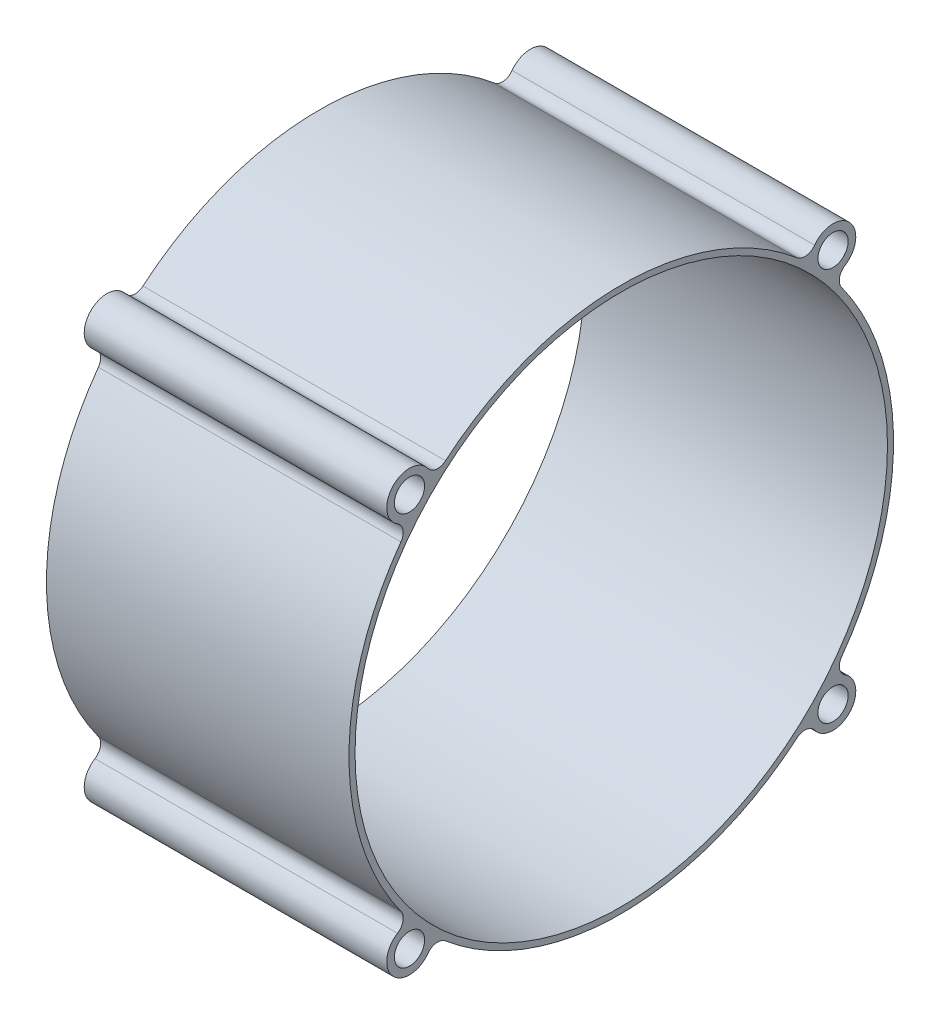
ISO-10303-21;
HEADER;
FILE_DESCRIPTION(('STEP AP214'),'2;1');
FILE_NAME('part.step','',(''),(''),'','','');
FILE_SCHEMA(('AUTOMOTIVE_DESIGN { 1 0 10303 214 1 1 1 1 }'));
ENDSEC;
DATA;
#1=APPLICATION_CONTEXT('core data for automotive mechanical design processes');
#2=APPLICATION_PROTOCOL_DEFINITION('international standard','automotive_design',2000,#1);
#3=PRODUCT_CONTEXT('',#1,'mechanical');
#4=PRODUCT('Part','Part','',(#3));
#5=PRODUCT_RELATED_PRODUCT_CATEGORY('part','',(#4));
#6=PRODUCT_DEFINITION_FORMATION('','',#4);
#7=PRODUCT_DEFINITION_CONTEXT('part definition',#1,'design');
#8=PRODUCT_DEFINITION('design','',#6,#7);
#9=PRODUCT_DEFINITION_SHAPE('','',#8);
#10=(LENGTH_UNIT() NAMED_UNIT(*) SI_UNIT(.MILLI.,.METRE.));
#11=(NAMED_UNIT(*) PLANE_ANGLE_UNIT() SI_UNIT($,.RADIAN.));
#12=(NAMED_UNIT(*) SI_UNIT($,.STERADIAN.) SOLID_ANGLE_UNIT());
#13=UNCERTAINTY_MEASURE_WITH_UNIT(LENGTH_MEASURE(1.E-05),#10,'distance_accuracy_value','');
#14=(GEOMETRIC_REPRESENTATION_CONTEXT(3) GLOBAL_UNCERTAINTY_ASSIGNED_CONTEXT((#13)) GLOBAL_UNIT_ASSIGNED_CONTEXT((#10,
#11,#12)) REPRESENTATION_CONTEXT('',''));
#15=CARTESIAN_POINT('',(0.,0.,0.));
#16=DIRECTION('',(0.,0.,1.));
#17=DIRECTION('',(1.,0.,0.));
#18=AXIS2_PLACEMENT_3D('',#15,#16,#17);
#19=CARTESIAN_POINT('',(50.,0.,0.));
#20=DIRECTION('',(-1.,0.,0.));
#21=DIRECTION('',(0.,0.,1.));
#22=AXIS2_PLACEMENT_3D('',#19,#20,#21);
#23=CYLINDRICAL_SURFACE('',#22,44.);
#24=CARTESIAN_POINT('',(0.,0.,0.));
#25=DIRECTION('',(1.,0.,0.));
#26=DIRECTION('',(0.,0.,-1.));
#27=AXIS2_PLACEMENT_3D('',#24,#25,#26);
#28=CIRCLE('',#27,44.);
#29=CARTESIAN_POINT('',(0.,0.,-44.));
#30=VERTEX_POINT('',#29);
#31=EDGE_CURVE('E509',#30,#30,#28,.T.);
#32=ORIENTED_EDGE('',*,*,#31,.F.);
#33=EDGE_LOOP('',(#32));
#34=FACE_BOUND('',#33,.T.);
#35=CARTESIAN_POINT('',(50.,0.,0.));
#36=DIRECTION('',(1.,0.,0.));
#37=DIRECTION('',(0.,0.,-1.));
#38=AXIS2_PLACEMENT_3D('',#35,#36,#37);
#39=CIRCLE('',#38,44.);
#40=CARTESIAN_POINT('',(50.,0.,-44.));
#41=VERTEX_POINT('',#40);
#42=EDGE_CURVE('E501',#41,#41,#39,.T.);
#43=ORIENTED_EDGE('',*,*,#42,.T.);
#44=EDGE_LOOP('',(#43));
#45=FACE_BOUND('',#44,.T.);
#46=ADVANCED_FACE('F258',(#34,#45),#23,.F.);
#47=CARTESIAN_POINT('',(0.,0.,0.));
#48=DIRECTION('',(1.,0.,0.));
#49=DIRECTION('',(0.,0.,-1.));
#50=AXIS2_PLACEMENT_3D('',#47,#48,#49);
#51=PLANE('',#50);
#52=CARTESIAN_POINT('',(0.,-32.4999999999999,-35.));
#53=DIRECTION('',(1.,0.,0.));
#54=DIRECTION('',(0.,0.,-1.));
#55=AXIS2_PLACEMENT_3D('',#52,#53,#54);
#56=CIRCLE('',#55,2.5);
#57=CARTESIAN_POINT('',(0.,-32.4999999999999,-37.5));
#58=VERTEX_POINT('',#57);
#59=EDGE_CURVE('E408',#58,#58,#56,.T.);
#60=ORIENTED_EDGE('',*,*,#59,.T.);
#61=EDGE_LOOP('',(#60));
#62=FACE_BOUND('',#61,.T.);
#63=CARTESIAN_POINT('',(0.,0.,0.));
#64=DIRECTION('',(1.,0.,0.));
#65=DIRECTION('',(0.,0.,-1.));
#66=AXIS2_PLACEMENT_3D('',#63,#64,#65);
#67=CIRCLE('',#66,45.);
#68=CARTESIAN_POINT('',(0.,-26.4296981736849,-36.4207503279095));
#69=VERTEX_POINT('',#68);
#70=CARTESIAN_POINT('',(0.,26.4296981736849,-36.4207503279095));
#71=VERTEX_POINT('',#70);
#72=EDGE_CURVE('E389',#69,#71,#67,.T.);
#73=ORIENTED_EDGE('',*,*,#72,.F.);
#74=CARTESIAN_POINT('',(0.,-27.6043514258486,-38.0394503424832));
#75=DIRECTION('',(1.,0.,0.));
#76=DIRECTION('',(0.,0.,-1.));
#77=AXIS2_PLACEMENT_3D('',#74,#75,#76);
#78=CIRCLE('',#77,2.);
#79=CARTESIAN_POINT('',(0.,-29.3035117035373,-36.9845312220172));
#80=VERTEX_POINT('',#79);
#81=EDGE_CURVE('E372',#69,#80,#78,.T.);
#82=ORIENTED_EDGE('',*,*,#81,.T.);
#83=CARTESIAN_POINT('',(0.,-32.4999999999999,-35.));
#84=DIRECTION('',(1.,0.,0.));
#85=DIRECTION('',(0.,0.,-1.));
#86=AXIS2_PLACEMENT_3D('',#83,#84,#85);
#87=CIRCLE('',#86,3.76243293635696);
#88=CARTESIAN_POINT('',(0.,-34.7155467090924,-31.9590701454303));
#89=VERTEX_POINT('',#88);
#90=EDGE_CURVE('E571',#89,#80,#87,.T.);
#91=ORIENTED_EDGE('',*,*,#90,.F.);
#92=CARTESIAN_POINT('',(0.,-35.8932669483999,-30.3426002143999));
#93=DIRECTION('',(1.,0.,0.));
#94=DIRECTION('',(0.,0.,-1.));
#95=AXIS2_PLACEMENT_3D('',#92,#93,#94);
#96=CIRCLE('',#95,2.);
#97=CARTESIAN_POINT('',(0.,-34.3658938867659,-29.0514257371914));
#98=VERTEX_POINT('',#97);
#99=EDGE_CURVE('E462',#89,#98,#96,.T.);
#100=ORIENTED_EDGE('',*,*,#99,.T.);
#101=CARTESIAN_POINT('',(0.,-34.3658938867659,29.0514257371913));
#102=VERTEX_POINT('',#101);
#103=EDGE_CURVE('E401',#102,#98,#67,.T.);
#104=ORIENTED_EDGE('',*,*,#103,.F.);
#105=CARTESIAN_POINT('',(0.,-35.8932669484,30.3426002143998));
#106=DIRECTION('',(1.,0.,0.));
#107=DIRECTION('',(0.,0.,-1.));
#108=AXIS2_PLACEMENT_3D('',#105,#106,#107);
#109=CIRCLE('',#108,2.);
#110=CARTESIAN_POINT('',(0.,-34.7155467090925,31.9590701454302));
#111=VERTEX_POINT('',#110);
#112=EDGE_CURVE('E468',#102,#111,#109,.T.);
#113=ORIENTED_EDGE('',*,*,#112,.T.);
#114=CARTESIAN_POINT('',(0.,-32.5,35.));
#115=DIRECTION('',(1.,0.,0.));
#116=DIRECTION('',(0.,0.,-1.));
#117=AXIS2_PLACEMENT_3D('',#114,#115,#116);
#118=CIRCLE('',#117,3.762432936357);
#119=CARTESIAN_POINT('',(0.,-29.3035117035373,36.9845312220172));
#120=VERTEX_POINT('',#119);
#121=EDGE_CURVE('E529',#120,#111,#118,.T.);
#122=ORIENTED_EDGE('',*,*,#121,.F.);
#123=CARTESIAN_POINT('',(0.,-27.6043514258486,38.0394503424832));
#124=DIRECTION('',(1.,0.,0.));
#125=DIRECTION('',(0.,0.,-1.));
#126=AXIS2_PLACEMENT_3D('',#123,#124,#125);
#127=CIRCLE('',#126,2.);
#128=CARTESIAN_POINT('',(0.,-26.4296981736849,36.4207503279095));
#129=VERTEX_POINT('',#128);
#130=EDGE_CURVE('E474',#120,#129,#127,.T.);
#131=ORIENTED_EDGE('',*,*,#130,.T.);
#132=CARTESIAN_POINT('',(0.,0.,0.));
#133=DIRECTION('',(1.,0.,0.));
#134=DIRECTION('',(0.,0.,-1.));
#135=AXIS2_PLACEMENT_3D('',#132,#133,#134);
#136=CIRCLE('',#135,45.);
#137=CARTESIAN_POINT('',(0.,26.4296981736849,36.4207503279095));
#138=VERTEX_POINT('',#137);
#139=EDGE_CURVE('E505',#138,#129,#136,.T.);
#140=ORIENTED_EDGE('',*,*,#139,.F.);
#141=CARTESIAN_POINT('',(0.,27.6043514258486,38.0394503424832));
#142=DIRECTION('',(1.,0.,0.));
#143=DIRECTION('',(0.,0.,-1.));
#144=AXIS2_PLACEMENT_3D('',#141,#142,#143);
#145=CIRCLE('',#144,2.);
#146=CARTESIAN_POINT('',(0.,29.3035117035373,36.9845312220172));
#147=VERTEX_POINT('',#146);
#148=EDGE_CURVE('E480',#138,#147,#145,.T.);
#149=ORIENTED_EDGE('',*,*,#148,.T.);
#150=CARTESIAN_POINT('',(0.,32.5,35.));
#151=DIRECTION('',(1.,0.,0.));
#152=DIRECTION('',(0.,0.,-1.));
#153=AXIS2_PLACEMENT_3D('',#150,#151,#152);
#154=CIRCLE('',#153,3.762432936357);
#155=CARTESIAN_POINT('',(0.,34.7155467090925,31.9590701454302));
#156=VERTEX_POINT('',#155);
#157=EDGE_CURVE('E545',#156,#147,#154,.T.);
#158=ORIENTED_EDGE('',*,*,#157,.F.);
#159=CARTESIAN_POINT('',(0.,35.8932669484,30.3426002143998));
#160=DIRECTION('',(1.,0.,0.));
#161=DIRECTION('',(0.,0.,-1.));
#162=AXIS2_PLACEMENT_3D('',#159,#160,#161);
#163=CIRCLE('',#162,2.);
#164=CARTESIAN_POINT('',(0.,34.3658938867659,29.0514257371913));
#165=VERTEX_POINT('',#164);
#166=EDGE_CURVE('E486',#156,#165,#163,.T.);
#167=ORIENTED_EDGE('',*,*,#166,.T.);
#168=CARTESIAN_POINT('',(0.,0.,0.));
#169=DIRECTION('',(1.,0.,0.));
#170=DIRECTION('',(0.,0.,-1.));
#171=AXIS2_PLACEMENT_3D('',#168,#169,#170);
#172=CIRCLE('',#171,45.);
#173=CARTESIAN_POINT('',(0.,34.3658938867659,-29.0514257371914));
#174=VERTEX_POINT('',#173);
#175=EDGE_CURVE('E517',#174,#165,#172,.T.);
#176=ORIENTED_EDGE('',*,*,#175,.F.);
#177=CARTESIAN_POINT('',(0.,35.8932669483999,-30.3426002143999));
#178=DIRECTION('',(1.,0.,0.));
#179=DIRECTION('',(0.,0.,-1.));
#180=AXIS2_PLACEMENT_3D('',#177,#178,#179);
#181=CIRCLE('',#180,2.);
#182=CARTESIAN_POINT('',(0.,34.7155467090924,-31.9590701454303));
#183=VERTEX_POINT('',#182);
#184=EDGE_CURVE('E492',#174,#183,#181,.T.);
#185=ORIENTED_EDGE('',*,*,#184,.T.);
#186=CARTESIAN_POINT('',(0.,32.4999999999999,-35.));
#187=DIRECTION('',(1.,0.,0.));
#188=DIRECTION('',(0.,0.,-1.));
#189=AXIS2_PLACEMENT_3D('',#186,#187,#188);
#190=CIRCLE('',#189,3.76243293635696);
#191=CARTESIAN_POINT('',(0.,29.3035117035373,-36.9845312220172));
#192=VERTEX_POINT('',#191);
#193=EDGE_CURVE('E560',#192,#183,#190,.T.);
#194=ORIENTED_EDGE('',*,*,#193,.F.);
#195=CARTESIAN_POINT('',(0.,27.6043514258486,-38.0394503424833));
#196=DIRECTION('',(1.,0.,0.));
#197=DIRECTION('',(0.,0.,-1.));
#198=AXIS2_PLACEMENT_3D('',#195,#196,#197);
#199=CIRCLE('',#198,2.);
#200=EDGE_CURVE('E267',#192,#71,#199,.T.);
#201=ORIENTED_EDGE('',*,*,#200,.T.);
#202=EDGE_LOOP('',(#73,#82,#91,#100,#104,#113,#122,#131,#140,#149,#158,#167,#176,#185,#194,#201));
#203=FACE_BOUND('',#202,.T.);
#204=ORIENTED_EDGE('',*,*,#31,.T.);
#205=EDGE_LOOP('',(#204));
#206=FACE_BOUND('',#205,.T.);
#207=CARTESIAN_POINT('',(0.,-32.5,35.));
#208=DIRECTION('',(1.,0.,0.));
#209=DIRECTION('',(0.,0.,-1.));
#210=AXIS2_PLACEMENT_3D('',#207,#208,#209);
#211=CIRCLE('',#210,2.5);
#212=CARTESIAN_POINT('',(0.,-32.5,32.5));
#213=VERTEX_POINT('',#212);
#214=EDGE_CURVE('E533',#213,#213,#211,.T.);
#215=ORIENTED_EDGE('',*,*,#214,.T.);
#216=EDGE_LOOP('',(#215));
#217=FACE_BOUND('',#216,.T.);
#218=CARTESIAN_POINT('',(0.,32.5,35.));
#219=DIRECTION('',(1.,0.,0.));
#220=DIRECTION('',(0.,0.,-1.));
#221=AXIS2_PLACEMENT_3D('',#218,#219,#220);
#222=CIRCLE('',#221,2.5);
#223=CARTESIAN_POINT('',(0.,32.5,32.5));
#224=VERTEX_POINT('',#223);
#225=EDGE_CURVE('E549',#224,#224,#222,.F.);
#226=ORIENTED_EDGE('',*,*,#225,.F.);
#227=EDGE_LOOP('',(#226));
#228=FACE_BOUND('',#227,.T.);
#229=CARTESIAN_POINT('',(0.,32.4999999999999,-35.));
#230=DIRECTION('',(1.,0.,0.));
#231=DIRECTION('',(0.,0.,-1.));
#232=AXIS2_PLACEMENT_3D('',#229,#230,#231);
#233=CIRCLE('',#232,2.5);
#234=CARTESIAN_POINT('',(0.,32.4999999999999,-37.5));
#235=VERTEX_POINT('',#234);
#236=EDGE_CURVE('E563',#235,#235,#233,.T.);
#237=ORIENTED_EDGE('',*,*,#236,.T.);
#238=EDGE_LOOP('',(#237));
#239=FACE_BOUND('',#238,.T.);
#240=ADVANCED_FACE('F396',(#62,#203,#206,#217,#228,#239),#51,.F.);
#241=CARTESIAN_POINT('',(50.,0.,0.));
#242=DIRECTION('',(-1.,0.,0.));
#243=DIRECTION('',(0.,0.,1.));
#244=AXIS2_PLACEMENT_3D('',#241,#242,#243);
#245=CYLINDRICAL_SURFACE('',#244,45.);
#246=ORIENTED_EDGE('',*,*,#139,.T.);
#247=DIRECTION('',(-1.,0.,0.));
#248=VECTOR('',#247,1.);
#249=CARTESIAN_POINT('',(50.,-26.4296981736849,36.4207503279095));
#250=LINE('',#249,#248);
#251=CARTESIAN_POINT('',(50.,-26.4296981736849,36.4207503279095));
#252=VERTEX_POINT('',#251);
#253=EDGE_CURVE('E437',#129,#252,#250,.F.);
#254=ORIENTED_EDGE('',*,*,#253,.T.);
#255=CARTESIAN_POINT('',(50.,0.,0.));
#256=DIRECTION('',(1.,0.,0.));
#257=DIRECTION('',(0.,0.,-1.));
#258=AXIS2_PLACEMENT_3D('',#255,#256,#257);
#259=CIRCLE('',#258,45.);
#260=CARTESIAN_POINT('',(50.,26.4296981736849,36.4207503279095));
#261=VERTEX_POINT('',#260);
#262=EDGE_CURVE('E412',#261,#252,#259,.T.);
#263=ORIENTED_EDGE('',*,*,#262,.F.);
#264=DIRECTION('',(-1.,0.,0.));
#265=VECTOR('',#264,1.);
#266=CARTESIAN_POINT('',(50.,26.4296981736849,36.4207503279095));
#267=LINE('',#266,#265);
#268=EDGE_CURVE('E433',#261,#138,#267,.T.);
#269=ORIENTED_EDGE('',*,*,#268,.T.);
#270=EDGE_LOOP('',(#246,#254,#263,#269));
#271=FACE_BOUND('',#270,.T.);
#272=ADVANCED_FACE('F604',(#271),#245,.T.);
#273=CARTESIAN_POINT('',(50.,0.,0.));
#274=DIRECTION('',(1.,0.,0.));
#275=DIRECTION('',(0.,0.,-1.));
#276=AXIS2_PLACEMENT_3D('',#273,#274,#275);
#277=PLANE('',#276);
#278=CARTESIAN_POINT('',(50.,-32.4999999999999,-35.));
#279=DIRECTION('',(1.,0.,0.));
#280=DIRECTION('',(0.,0.,-1.));
#281=AXIS2_PLACEMENT_3D('',#278,#279,#280);
#282=CIRCLE('',#281,2.5);
#283=CARTESIAN_POINT('',(50.,-32.4999999999999,-37.5));
#284=VERTEX_POINT('',#283);
#285=EDGE_CURVE('E682',#284,#284,#282,.T.);
#286=ORIENTED_EDGE('',*,*,#285,.F.);
#287=EDGE_LOOP('',(#286));
#288=FACE_BOUND('',#287,.T.);
#289=CARTESIAN_POINT('',(50.,0.,0.));
#290=DIRECTION('',(1.,0.,0.));
#291=DIRECTION('',(0.,0.,-1.));
#292=AXIS2_PLACEMENT_3D('',#289,#290,#291);
#293=CIRCLE('',#292,45.);
#294=CARTESIAN_POINT('',(50.,-34.3658938867659,29.0514257371913));
#295=VERTEX_POINT('',#294);
#296=CARTESIAN_POINT('',(50.,-34.3658938867659,-29.0514257371914));
#297=VERTEX_POINT('',#296);
#298=EDGE_CURVE('E400',#295,#297,#293,.T.);
#299=ORIENTED_EDGE('',*,*,#298,.T.);
#300=CARTESIAN_POINT('',(50.,-35.8932669483999,-30.3426002143999));
#301=DIRECTION('',(1.,0.,0.));
#302=DIRECTION('',(0.,0.,-1.));
#303=AXIS2_PLACEMENT_3D('',#300,#301,#302);
#304=CIRCLE('',#303,2.);
#305=CARTESIAN_POINT('',(50.,-34.7155467090924,-31.9590701454303));
#306=VERTEX_POINT('',#305);
#307=EDGE_CURVE('E465',#297,#306,#304,.F.);
#308=ORIENTED_EDGE('',*,*,#307,.T.);
#309=CARTESIAN_POINT('',(50.,-32.4999999999999,-35.));
#310=DIRECTION('',(1.,0.,0.));
#311=DIRECTION('',(0.,0.,-1.));
#312=AXIS2_PLACEMENT_3D('',#309,#310,#311);
#313=CIRCLE('',#312,3.76243293635696);
#314=CARTESIAN_POINT('',(50.,-29.3035117035373,-36.9845312220172));
#315=VERTEX_POINT('',#314);
#316=EDGE_CURVE('E567',#306,#315,#313,.T.);
#317=ORIENTED_EDGE('',*,*,#316,.T.);
#318=CARTESIAN_POINT('',(50.,-27.6043514258486,-38.0394503424832));
#319=DIRECTION('',(1.,0.,0.));
#320=DIRECTION('',(0.,0.,-1.));
#321=AXIS2_PLACEMENT_3D('',#318,#319,#320);
#322=CIRCLE('',#321,2.);
#323=CARTESIAN_POINT('',(50.,-26.4296981736849,-36.4207503279095));
#324=VERTEX_POINT('',#323);
#325=EDGE_CURVE('E383',#315,#324,#322,.F.);
#326=ORIENTED_EDGE('',*,*,#325,.T.);
#327=CARTESIAN_POINT('',(50.,26.4296981736849,-36.4207503279095));
#328=VERTEX_POINT('',#327);
#329=EDGE_CURVE('E391',#324,#328,#293,.T.);
#330=ORIENTED_EDGE('',*,*,#329,.T.);
#331=CARTESIAN_POINT('',(50.,27.6043514258486,-38.0394503424833));
#332=DIRECTION('',(1.,0.,0.));
#333=DIRECTION('',(0.,0.,-1.));
#334=AXIS2_PLACEMENT_3D('',#331,#332,#333);
#335=CIRCLE('',#334,2.);
#336=CARTESIAN_POINT('',(50.,29.3035117035373,-36.9845312220172));
#337=VERTEX_POINT('',#336);
#338=EDGE_CURVE('E12',#328,#337,#335,.F.);
#339=ORIENTED_EDGE('',*,*,#338,.T.);
#340=CARTESIAN_POINT('',(50.,32.4999999999999,-35.));
#341=DIRECTION('',(1.,0.,0.));
#342=DIRECTION('',(0.,0.,-1.));
#343=AXIS2_PLACEMENT_3D('',#340,#341,#342);
#344=CIRCLE('',#343,3.76243293635696);
#345=CARTESIAN_POINT('',(50.,34.7155467090924,-31.9590701454303));
#346=VERTEX_POINT('',#345);
#347=EDGE_CURVE('E553',#337,#346,#344,.T.);
#348=ORIENTED_EDGE('',*,*,#347,.T.);
#349=CARTESIAN_POINT('',(50.,35.8932669483999,-30.3426002143999));
#350=DIRECTION('',(1.,0.,0.));
#351=DIRECTION('',(0.,0.,-1.));
#352=AXIS2_PLACEMENT_3D('',#349,#350,#351);
#353=CIRCLE('',#352,2.);
#354=CARTESIAN_POINT('',(50.,34.3658938867659,-29.0514257371914));
#355=VERTEX_POINT('',#354);
#356=EDGE_CURVE('E495',#346,#355,#353,.F.);
#357=ORIENTED_EDGE('',*,*,#356,.T.);
#358=CARTESIAN_POINT('',(50.,0.,0.));
#359=DIRECTION('',(1.,0.,0.));
#360=DIRECTION('',(0.,0.,-1.));
#361=AXIS2_PLACEMENT_3D('',#358,#359,#360);
#362=CIRCLE('',#361,45.);
#363=CARTESIAN_POINT('',(50.,34.3658938867659,29.0514257371913));
#364=VERTEX_POINT('',#363);
#365=EDGE_CURVE('E513',#355,#364,#362,.T.);
#366=ORIENTED_EDGE('',*,*,#365,.T.);
#367=CARTESIAN_POINT('',(50.,35.8932669484,30.3426002143998));
#368=DIRECTION('',(1.,0.,0.));
#369=DIRECTION('',(0.,0.,-1.));
#370=AXIS2_PLACEMENT_3D('',#367,#368,#369);
#371=CIRCLE('',#370,2.);
#372=CARTESIAN_POINT('',(50.,34.7155467090925,31.9590701454302));
#373=VERTEX_POINT('',#372);
#374=EDGE_CURVE('E489',#364,#373,#371,.F.);
#375=ORIENTED_EDGE('',*,*,#374,.T.);
#376=CARTESIAN_POINT('',(50.,32.5,35.));
#377=DIRECTION('',(1.,0.,0.));
#378=DIRECTION('',(0.,0.,-1.));
#379=AXIS2_PLACEMENT_3D('',#376,#377,#378);
#380=CIRCLE('',#379,3.762432936357);
#381=CARTESIAN_POINT('',(50.,29.3035117035373,36.9845312220172));
#382=VERTEX_POINT('',#381);
#383=EDGE_CURVE('E537',#373,#382,#380,.T.);
#384=ORIENTED_EDGE('',*,*,#383,.T.);
#385=CARTESIAN_POINT('',(50.,27.6043514258486,38.0394503424832));
#386=DIRECTION('',(1.,0.,0.));
#387=DIRECTION('',(0.,0.,-1.));
#388=AXIS2_PLACEMENT_3D('',#385,#386,#387);
#389=CIRCLE('',#388,2.);
#390=EDGE_CURVE('E483',#382,#261,#389,.F.);
#391=ORIENTED_EDGE('',*,*,#390,.T.);
#392=ORIENTED_EDGE('',*,*,#262,.T.);
#393=CARTESIAN_POINT('',(50.,-27.6043514258486,38.0394503424832));
#394=DIRECTION('',(1.,0.,0.));
#395=DIRECTION('',(0.,0.,-1.));
#396=AXIS2_PLACEMENT_3D('',#393,#394,#395);
#397=CIRCLE('',#396,2.);
#398=CARTESIAN_POINT('',(50.,-29.3035117035373,36.9845312220172));
#399=VERTEX_POINT('',#398);
#400=EDGE_CURVE('E477',#252,#399,#397,.F.);
#401=ORIENTED_EDGE('',*,*,#400,.T.);
#402=CARTESIAN_POINT('',(50.,-32.5,35.));
#403=DIRECTION('',(1.,0.,0.));
#404=DIRECTION('',(0.,0.,-1.));
#405=AXIS2_PLACEMENT_3D('',#402,#403,#404);
#406=CIRCLE('',#405,3.762432936357);
#407=CARTESIAN_POINT('',(50.,-34.7155467090925,31.9590701454302));
#408=VERTEX_POINT('',#407);
#409=EDGE_CURVE('E521',#399,#408,#406,.T.);
#410=ORIENTED_EDGE('',*,*,#409,.T.);
#411=CARTESIAN_POINT('',(50.,-35.8932669484,30.3426002143998));
#412=DIRECTION('',(1.,0.,0.));
#413=DIRECTION('',(0.,0.,-1.));
#414=AXIS2_PLACEMENT_3D('',#411,#412,#413);
#415=CIRCLE('',#414,2.);
#416=EDGE_CURVE('E471',#408,#295,#415,.F.);
#417=ORIENTED_EDGE('',*,*,#416,.T.);
#418=EDGE_LOOP('',(#299,#308,#317,#326,#330,#339,#348,#357,#366,#375,#384,#391,#392,#401,#410,#417));
#419=FACE_BOUND('',#418,.T.);
#420=ORIENTED_EDGE('',*,*,#42,.F.);
#421=EDGE_LOOP('',(#420));
#422=FACE_BOUND('',#421,.T.);
#423=CARTESIAN_POINT('',(50.,-32.5,35.));
#424=DIRECTION('',(1.,0.,0.));
#425=DIRECTION('',(0.,0.,-1.));
#426=AXIS2_PLACEMENT_3D('',#423,#424,#425);
#427=CIRCLE('',#426,2.5);
#428=CARTESIAN_POINT('',(50.,-32.5,32.5));
#429=VERTEX_POINT('',#428);
#430=EDGE_CURVE('E525',#429,#429,#427,.T.);
#431=ORIENTED_EDGE('',*,*,#430,.F.);
#432=EDGE_LOOP('',(#431));
#433=FACE_BOUND('',#432,.T.);
#434=CARTESIAN_POINT('',(50.,32.5,35.));
#435=DIRECTION('',(1.,0.,0.));
#436=DIRECTION('',(0.,0.,-1.));
#437=AXIS2_PLACEMENT_3D('',#434,#435,#436);
#438=CIRCLE('',#437,2.5);
#439=CARTESIAN_POINT('',(50.,32.5,32.5));
#440=VERTEX_POINT('',#439);
#441=EDGE_CURVE('E541',#440,#440,#438,.F.);
#442=ORIENTED_EDGE('',*,*,#441,.T.);
#443=EDGE_LOOP('',(#442));
#444=FACE_BOUND('',#443,.T.);
#445=CARTESIAN_POINT('',(50.,32.4999999999999,-35.));
#446=DIRECTION('',(1.,0.,0.));
#447=DIRECTION('',(0.,0.,-1.));
#448=AXIS2_PLACEMENT_3D('',#445,#446,#447);
#449=CIRCLE('',#448,2.5);
#450=CARTESIAN_POINT('',(50.,32.4999999999999,-37.5));
#451=VERTEX_POINT('',#450);
#452=EDGE_CURVE('E556',#451,#451,#449,.T.);
#453=ORIENTED_EDGE('',*,*,#452,.F.);
#454=EDGE_LOOP('',(#453));
#455=FACE_BOUND('',#454,.T.);
#456=ADVANCED_FACE('F574',(#288,#419,#422,#433,#444,#455),#277,.T.);
#457=CARTESIAN_POINT('',(50.,32.4999999999999,-35.));
#458=DIRECTION('',(-1.,0.,0.));
#459=DIRECTION('',(0.,0.,1.));
#460=AXIS2_PLACEMENT_3D('',#457,#458,#459);
#461=CYLINDRICAL_SURFACE('',#460,2.5);
#462=ORIENTED_EDGE('',*,*,#452,.T.);
#463=EDGE_LOOP('',(#462));
#464=FACE_BOUND('',#463,.T.);
#465=ORIENTED_EDGE('',*,*,#236,.F.);
#466=EDGE_LOOP('',(#465));
#467=FACE_BOUND('',#466,.T.);
#468=ADVANCED_FACE('F653',(#464,#467),#461,.F.);
#469=CARTESIAN_POINT('',(50.,32.4999999999999,-35.));
#470=DIRECTION('',(-1.,0.,0.));
#471=DIRECTION('',(0.,0.,1.));
#472=AXIS2_PLACEMENT_3D('',#469,#470,#471);
#473=CYLINDRICAL_SURFACE('',#472,3.76243293635696);
#474=ORIENTED_EDGE('',*,*,#193,.T.);
#475=DIRECTION('',(-1.,0.,0.));
#476=VECTOR('',#475,1.);
#477=CARTESIAN_POINT('',(50.,34.7155467090924,-31.9590701454303));
#478=LINE('',#477,#476);
#479=EDGE_CURVE('E274',#183,#346,#478,.F.);
#480=ORIENTED_EDGE('',*,*,#479,.T.);
#481=ORIENTED_EDGE('',*,*,#347,.F.);
#482=DIRECTION('',(-1.,0.,0.));
#483=VECTOR('',#482,1.);
#484=CARTESIAN_POINT('',(50.,29.3035117035373,-36.9845312220172));
#485=LINE('',#484,#483);
#486=EDGE_CURVE('E454',#337,#192,#485,.T.);
#487=ORIENTED_EDGE('',*,*,#486,.T.);
#488=EDGE_LOOP('',(#474,#480,#481,#487));
#489=FACE_BOUND('',#488,.T.);
#490=ADVANCED_FACE('F578',(#489),#473,.T.);
#491=CARTESIAN_POINT('',(50.,0.,0.));
#492=DIRECTION('',(-1.,0.,0.));
#493=DIRECTION('',(0.,0.,1.));
#494=AXIS2_PLACEMENT_3D('',#491,#492,#493);
#495=CYLINDRICAL_SURFACE('',#494,45.);
#496=ORIENTED_EDGE('',*,*,#329,.F.);
#497=DIRECTION('',(-1.,0.,0.));
#498=VECTOR('',#497,1.);
#499=CARTESIAN_POINT('',(50.,-26.4296981736849,-36.4207503279095));
#500=LINE('',#499,#498);
#501=EDGE_CURVE('E376',#324,#69,#500,.T.);
#502=ORIENTED_EDGE('',*,*,#501,.T.);
#503=ORIENTED_EDGE('',*,*,#72,.T.);
#504=DIRECTION('',(-1.,0.,0.));
#505=VECTOR('',#504,1.);
#506=CARTESIAN_POINT('',(50.,26.4296981736849,-36.4207503279095));
#507=LINE('',#506,#505);
#508=EDGE_CURVE('E394',#71,#328,#507,.F.);
#509=ORIENTED_EDGE('',*,*,#508,.T.);
#510=EDGE_LOOP('',(#496,#502,#503,#509));
#511=FACE_BOUND('',#510,.T.);
#512=ADVANCED_FACE('F388',(#511),#495,.T.);
#513=CARTESIAN_POINT('',(50.,-32.4999999999999,-35.));
#514=DIRECTION('',(-1.,0.,0.));
#515=DIRECTION('',(0.,0.,1.));
#516=AXIS2_PLACEMENT_3D('',#513,#514,#515);
#517=CYLINDRICAL_SURFACE('',#516,3.76243293635696);
#518=ORIENTED_EDGE('',*,*,#90,.T.);
#519=DIRECTION('',(-1.,0.,0.));
#520=VECTOR('',#519,1.);
#521=CARTESIAN_POINT('',(50.,-29.3035117035373,-36.9845312220172));
#522=LINE('',#521,#520);
#523=EDGE_CURVE('E377',#80,#315,#522,.F.);
#524=ORIENTED_EDGE('',*,*,#523,.T.);
#525=ORIENTED_EDGE('',*,*,#316,.F.);
#526=DIRECTION('',(-1.,0.,0.));
#527=VECTOR('',#526,1.);
#528=CARTESIAN_POINT('',(50.,-34.7155467090924,-31.9590701454303));
#529=LINE('',#528,#527);
#530=EDGE_CURVE('E393',#306,#89,#529,.T.);
#531=ORIENTED_EDGE('',*,*,#530,.T.);
#532=EDGE_LOOP('',(#518,#524,#525,#531));
#533=FACE_BOUND('',#532,.T.);
#534=ADVANCED_FACE('F630',(#533),#517,.T.);
#535=CARTESIAN_POINT('',(50.,-32.5,35.));
#536=DIRECTION('',(-1.,0.,0.));
#537=DIRECTION('',(0.,0.,1.));
#538=AXIS2_PLACEMENT_3D('',#535,#536,#537);
#539=CYLINDRICAL_SURFACE('',#538,2.5);
#540=ORIENTED_EDGE('',*,*,#430,.T.);
#541=EDGE_LOOP('',(#540));
#542=FACE_BOUND('',#541,.T.);
#543=ORIENTED_EDGE('',*,*,#214,.F.);
#544=EDGE_LOOP('',(#543));
#545=FACE_BOUND('',#544,.T.);
#546=ADVANCED_FACE('F632',(#542,#545),#539,.F.);
#547=CARTESIAN_POINT('',(50.,32.5,35.));
#548=DIRECTION('',(-1.,0.,0.));
#549=DIRECTION('',(0.,0.,1.));
#550=AXIS2_PLACEMENT_3D('',#547,#548,#549);
#551=CYLINDRICAL_SURFACE('',#550,2.5);
#552=ORIENTED_EDGE('',*,*,#441,.F.);
#553=EDGE_LOOP('',(#552));
#554=FACE_BOUND('',#553,.T.);
#555=ORIENTED_EDGE('',*,*,#225,.T.);
#556=EDGE_LOOP('',(#555));
#557=FACE_BOUND('',#556,.T.);
#558=ADVANCED_FACE('F638',(#554,#557),#551,.F.);
#559=ORIENTED_EDGE('',*,*,#175,.T.);
#560=DIRECTION('',(-1.,0.,0.));
#561=VECTOR('',#560,1.);
#562=CARTESIAN_POINT('',(50.,34.365893886766,29.0514257371913));
#563=LINE('',#562,#561);
#564=EDGE_CURVE('E451',#165,#364,#563,.F.);
#565=ORIENTED_EDGE('',*,*,#564,.T.);
#566=ORIENTED_EDGE('',*,*,#365,.F.);
#567=DIRECTION('',(-1.,0.,0.));
#568=VECTOR('',#567,1.);
#569=CARTESIAN_POINT('',(50.,34.3658938867659,-29.0514257371914));
#570=LINE('',#569,#568);
#571=EDGE_CURVE('E447',#355,#174,#570,.T.);
#572=ORIENTED_EDGE('',*,*,#571,.T.);
#573=EDGE_LOOP('',(#559,#565,#566,#572));
#574=FACE_BOUND('',#573,.T.);
#575=ADVANCED_FACE('F586',(#574),#495,.T.);
#576=CARTESIAN_POINT('',(50.,32.5,35.));
#577=DIRECTION('',(-1.,0.,0.));
#578=DIRECTION('',(0.,0.,1.));
#579=AXIS2_PLACEMENT_3D('',#576,#577,#578);
#580=CYLINDRICAL_SURFACE('',#579,3.762432936357);
#581=ORIENTED_EDGE('',*,*,#157,.T.);
#582=DIRECTION('',(-1.,0.,0.));
#583=VECTOR('',#582,1.);
#584=CARTESIAN_POINT('',(50.,29.3035117035373,36.9845312220172));
#585=LINE('',#584,#583);
#586=EDGE_CURVE('E444',#147,#382,#585,.F.);
#587=ORIENTED_EDGE('',*,*,#586,.T.);
#588=ORIENTED_EDGE('',*,*,#383,.F.);
#589=DIRECTION('',(-1.,0.,0.));
#590=VECTOR('',#589,1.);
#591=CARTESIAN_POINT('',(50.,34.7155467090925,31.9590701454302));
#592=LINE('',#591,#590);
#593=EDGE_CURVE('E440',#373,#156,#592,.T.);
#594=ORIENTED_EDGE('',*,*,#593,.T.);
#595=EDGE_LOOP('',(#581,#587,#588,#594));
#596=FACE_BOUND('',#595,.T.);
#597=ADVANCED_FACE('F595',(#596),#580,.T.);
#598=ORIENTED_EDGE('',*,*,#103,.T.);
#599=DIRECTION('',(-1.,0.,0.));
#600=VECTOR('',#599,1.);
#601=CARTESIAN_POINT('',(50.,-34.3658938867659,-29.0514257371914));
#602=LINE('',#601,#600);
#603=EDGE_CURVE('E423',#98,#297,#602,.F.);
#604=ORIENTED_EDGE('',*,*,#603,.T.);
#605=ORIENTED_EDGE('',*,*,#298,.F.);
#606=DIRECTION('',(-1.,0.,0.));
#607=VECTOR('',#606,1.);
#608=CARTESIAN_POINT('',(50.,-34.3658938867659,29.0514257371913));
#609=LINE('',#608,#607);
#610=EDGE_CURVE('E419',#295,#102,#609,.T.);
#611=ORIENTED_EDGE('',*,*,#610,.T.);
#612=EDGE_LOOP('',(#598,#604,#605,#611));
#613=FACE_BOUND('',#612,.T.);
#614=ADVANCED_FACE('F622',(#613),#495,.T.);
#615=CARTESIAN_POINT('',(50.,-32.5,35.));
#616=DIRECTION('',(-1.,0.,0.));
#617=DIRECTION('',(0.,0.,1.));
#618=AXIS2_PLACEMENT_3D('',#615,#616,#617);
#619=CYLINDRICAL_SURFACE('',#618,3.762432936357);
#620=ORIENTED_EDGE('',*,*,#121,.T.);
#621=DIRECTION('',(-1.,0.,0.));
#622=VECTOR('',#621,1.);
#623=CARTESIAN_POINT('',(50.,-34.7155467090925,31.9590701454302));
#624=LINE('',#623,#622);
#625=EDGE_CURVE('E430',#111,#408,#624,.F.);
#626=ORIENTED_EDGE('',*,*,#625,.T.);
#627=ORIENTED_EDGE('',*,*,#409,.F.);
#628=DIRECTION('',(-1.,0.,0.));
#629=VECTOR('',#628,1.);
#630=CARTESIAN_POINT('',(50.,-29.3035117035373,36.9845312220172));
#631=LINE('',#630,#629);
#632=EDGE_CURVE('E426',#399,#120,#631,.T.);
#633=ORIENTED_EDGE('',*,*,#632,.T.);
#634=EDGE_LOOP('',(#620,#626,#627,#633));
#635=FACE_BOUND('',#634,.T.);
#636=ADVANCED_FACE('F613',(#635),#619,.T.);
#637=CARTESIAN_POINT('',(0.,-32.4999999999999,-35.));
#638=DIRECTION('',(1.,0.,0.));
#639=DIRECTION('',(0.,0.,-1.));
#640=AXIS2_PLACEMENT_3D('',#637,#638,#639);
#641=CYLINDRICAL_SURFACE('',#640,2.5);
#642=ORIENTED_EDGE('',*,*,#59,.F.);
#643=EDGE_LOOP('',(#642));
#644=FACE_BOUND('',#643,.T.);
#645=ORIENTED_EDGE('',*,*,#285,.T.);
#646=EDGE_LOOP('',(#645));
#647=FACE_BOUND('',#646,.T.);
#648=ADVANCED_FACE('F659',(#644,#647),#641,.F.);
#649=CARTESIAN_POINT('',(50.,-27.6043514258486,-38.0394503424832));
#650=DIRECTION('',(1.,0.,0.));
#651=DIRECTION('',(0.,0.,-1.));
#652=AXIS2_PLACEMENT_3D('',#649,#650,#651);
#653=CYLINDRICAL_SURFACE('',#652,2.);
#654=ORIENTED_EDGE('',*,*,#325,.F.);
#655=ORIENTED_EDGE('',*,*,#523,.F.);
#656=ORIENTED_EDGE('',*,*,#81,.F.);
#657=ORIENTED_EDGE('',*,*,#501,.F.);
#658=EDGE_LOOP('',(#654,#655,#656,#657));
#659=FACE_BOUND('',#658,.T.);
#660=ADVANCED_FACE('F375',(#659),#653,.F.);
#661=CARTESIAN_POINT('',(50.,-35.8932669483999,-30.3426002143999));
#662=DIRECTION('',(1.,0.,0.));
#663=DIRECTION('',(0.,0.,-1.));
#664=AXIS2_PLACEMENT_3D('',#661,#662,#663);
#665=CYLINDRICAL_SURFACE('',#664,2.);
#666=ORIENTED_EDGE('',*,*,#307,.F.);
#667=ORIENTED_EDGE('',*,*,#603,.F.);
#668=ORIENTED_EDGE('',*,*,#99,.F.);
#669=ORIENTED_EDGE('',*,*,#530,.F.);
#670=EDGE_LOOP('',(#666,#667,#668,#669));
#671=FACE_BOUND('',#670,.T.);
#672=ADVANCED_FACE('F628',(#671),#665,.F.);
#673=CARTESIAN_POINT('',(50.,-35.8932669484,30.3426002143998));
#674=DIRECTION('',(1.,0.,0.));
#675=DIRECTION('',(0.,0.,-1.));
#676=AXIS2_PLACEMENT_3D('',#673,#674,#675);
#677=CYLINDRICAL_SURFACE('',#676,2.);
#678=ORIENTED_EDGE('',*,*,#416,.F.);
#679=ORIENTED_EDGE('',*,*,#625,.F.);
#680=ORIENTED_EDGE('',*,*,#112,.F.);
#681=ORIENTED_EDGE('',*,*,#610,.F.);
#682=EDGE_LOOP('',(#678,#679,#680,#681));
#683=FACE_BOUND('',#682,.T.);
#684=ADVANCED_FACE('F619',(#683),#677,.F.);
#685=CARTESIAN_POINT('',(50.,-27.6043514258486,38.0394503424832));
#686=DIRECTION('',(1.,0.,0.));
#687=DIRECTION('',(0.,0.,-1.));
#688=AXIS2_PLACEMENT_3D('',#685,#686,#687);
#689=CYLINDRICAL_SURFACE('',#688,2.);
#690=ORIENTED_EDGE('',*,*,#400,.F.);
#691=ORIENTED_EDGE('',*,*,#253,.F.);
#692=ORIENTED_EDGE('',*,*,#130,.F.);
#693=ORIENTED_EDGE('',*,*,#632,.F.);
#694=EDGE_LOOP('',(#690,#691,#692,#693));
#695=FACE_BOUND('',#694,.T.);
#696=ADVANCED_FACE('F610',(#695),#689,.F.);
#697=CARTESIAN_POINT('',(50.,27.6043514258486,38.0394503424832));
#698=DIRECTION('',(1.,0.,0.));
#699=DIRECTION('',(0.,0.,-1.));
#700=AXIS2_PLACEMENT_3D('',#697,#698,#699);
#701=CYLINDRICAL_SURFACE('',#700,2.);
#702=ORIENTED_EDGE('',*,*,#390,.F.);
#703=ORIENTED_EDGE('',*,*,#586,.F.);
#704=ORIENTED_EDGE('',*,*,#148,.F.);
#705=ORIENTED_EDGE('',*,*,#268,.F.);
#706=EDGE_LOOP('',(#702,#703,#704,#705));
#707=FACE_BOUND('',#706,.T.);
#708=ADVANCED_FACE('F601',(#707),#701,.F.);
#709=CARTESIAN_POINT('',(50.,35.8932669484,30.3426002143998));
#710=DIRECTION('',(1.,0.,0.));
#711=DIRECTION('',(0.,0.,-1.));
#712=AXIS2_PLACEMENT_3D('',#709,#710,#711);
#713=CYLINDRICAL_SURFACE('',#712,2.);
#714=ORIENTED_EDGE('',*,*,#374,.F.);
#715=ORIENTED_EDGE('',*,*,#564,.F.);
#716=ORIENTED_EDGE('',*,*,#166,.F.);
#717=ORIENTED_EDGE('',*,*,#593,.F.);
#718=EDGE_LOOP('',(#714,#715,#716,#717));
#719=FACE_BOUND('',#718,.T.);
#720=ADVANCED_FACE('F592',(#719),#713,.F.);
#721=CARTESIAN_POINT('',(50.,35.8932669483999,-30.3426002143999));
#722=DIRECTION('',(1.,0.,0.));
#723=DIRECTION('',(0.,0.,-1.));
#724=AXIS2_PLACEMENT_3D('',#721,#722,#723);
#725=CYLINDRICAL_SURFACE('',#724,2.);
#726=ORIENTED_EDGE('',*,*,#356,.F.);
#727=ORIENTED_EDGE('',*,*,#479,.F.);
#728=ORIENTED_EDGE('',*,*,#184,.F.);
#729=ORIENTED_EDGE('',*,*,#571,.F.);
#730=EDGE_LOOP('',(#726,#727,#728,#729));
#731=FACE_BOUND('',#730,.T.);
#732=ADVANCED_FACE('F583',(#731),#725,.F.);
#733=CARTESIAN_POINT('',(50.,27.6043514258486,-38.0394503424833));
#734=DIRECTION('',(1.,0.,0.));
#735=DIRECTION('',(0.,0.,-1.));
#736=AXIS2_PLACEMENT_3D('',#733,#734,#735);
#737=CYLINDRICAL_SURFACE('',#736,2.);
#738=ORIENTED_EDGE('',*,*,#338,.F.);
#739=ORIENTED_EDGE('',*,*,#508,.F.);
#740=ORIENTED_EDGE('',*,*,#200,.F.);
#741=ORIENTED_EDGE('',*,*,#486,.F.);
#742=EDGE_LOOP('',(#738,#739,#740,#741));
#743=FACE_BOUND('',#742,.T.);
#744=ADVANCED_FACE('F260',(#743),#737,.F.);
#745=CLOSED_SHELL('',(#46,#240,#272,#456,#468,#490,#512,#534,#546,#558,#575,#597,#614,#636,#648,
#660,#672,#684,#696,#708,#720,#732,#744));
#746=MANIFOLD_SOLID_BREP('B2',#745);
#747=ADVANCED_BREP_SHAPE_REPRESENTATION('',(#18,#746),#14);
#748=SHAPE_DEFINITION_REPRESENTATION(#9,#747);
ENDSEC;
END-ISO-10303-21;
